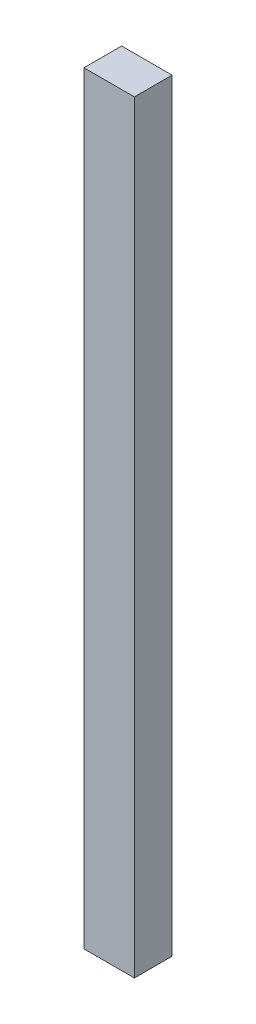
ISO-10303-21;
HEADER;
FILE_DESCRIPTION(('STEP AP214'),'2;1');
FILE_NAME('part.step','',(''),(''),'','','');
FILE_SCHEMA(('AUTOMOTIVE_DESIGN { 1 0 10303 214 1 1 1 1 }'));
ENDSEC;
DATA;
#1=APPLICATION_CONTEXT('core data for automotive mechanical design processes');
#2=APPLICATION_PROTOCOL_DEFINITION('international standard','automotive_design',2000,#1);
#3=PRODUCT_CONTEXT('',#1,'mechanical');
#4=PRODUCT('Part','Part','',(#3));
#5=PRODUCT_RELATED_PRODUCT_CATEGORY('part','',(#4));
#6=PRODUCT_DEFINITION_FORMATION('','',#4);
#7=PRODUCT_DEFINITION_CONTEXT('part definition',#1,'design');
#8=PRODUCT_DEFINITION('design','',#6,#7);
#9=PRODUCT_DEFINITION_SHAPE('','',#8);
#10=(LENGTH_UNIT() NAMED_UNIT(*) SI_UNIT(.MILLI.,.METRE.));
#11=(NAMED_UNIT(*) PLANE_ANGLE_UNIT() SI_UNIT($,.RADIAN.));
#12=(NAMED_UNIT(*) SI_UNIT($,.STERADIAN.) SOLID_ANGLE_UNIT());
#13=UNCERTAINTY_MEASURE_WITH_UNIT(LENGTH_MEASURE(1.E-05),#10,'distance_accuracy_value','');
#14=(GEOMETRIC_REPRESENTATION_CONTEXT(3) GLOBAL_UNCERTAINTY_ASSIGNED_CONTEXT((#13)) GLOBAL_UNIT_ASSIGNED_CONTEXT((#10,
#11,#12)) REPRESENTATION_CONTEXT('',''));
#15=CARTESIAN_POINT('',(0.,0.,0.));
#16=DIRECTION('',(0.,0.,1.));
#17=DIRECTION('',(1.,0.,0.));
#18=AXIS2_PLACEMENT_3D('',#15,#16,#17);
#19=CARTESIAN_POINT('',(-27.8320890870254,889.,24.5000784216773));
#20=DIRECTION('',(1.,0.,0.));
#21=DIRECTION('',(0.,0.,-1.));
#22=AXIS2_PLACEMENT_3D('',#19,#20,#21);
#23=PLANE('',#22);
#24=DIRECTION('',(0.,0.,1.));
#25=VECTOR('',#24,1.);
#26=CARTESIAN_POINT('',(-27.8320890870254,0.,24.5000784216773));
#27=LINE('',#26,#25);
#28=CARTESIAN_POINT('',(-27.8320890870254,0.,-19.4040621099685));
#29=VERTEX_POINT('',#28);
#30=CARTESIAN_POINT('',(-27.8320890870254,0.,24.5000784216773));
#31=VERTEX_POINT('',#30);
#32=EDGE_CURVE('E96',#29,#31,#27,.T.);
#33=ORIENTED_EDGE('',*,*,#32,.T.);
#34=DIRECTION('',(0.,-1.,0.));
#35=VECTOR('',#34,1.);
#36=CARTESIAN_POINT('',(-27.8320890870254,889.,24.5000784216773));
#37=LINE('',#36,#35);
#38=CARTESIAN_POINT('',(-27.8320890870254,889.,24.5000784216773));
#39=VERTEX_POINT('',#38);
#40=EDGE_CURVE('E11',#39,#31,#37,.T.);
#41=ORIENTED_EDGE('',*,*,#40,.F.);
#42=DIRECTION('',(0.,0.,1.));
#43=VECTOR('',#42,1.);
#44=CARTESIAN_POINT('',(-27.8320890870254,889.,24.5000784216773));
#45=LINE('',#44,#43);
#46=CARTESIAN_POINT('',(-27.8320890870254,889.,-19.4040621099685));
#47=VERTEX_POINT('',#46);
#48=EDGE_CURVE('E84',#47,#39,#45,.T.);
#49=ORIENTED_EDGE('',*,*,#48,.F.);
#50=DIRECTION('',(0.,-1.,0.));
#51=VECTOR('',#50,1.);
#52=CARTESIAN_POINT('',(-27.8320890870254,889.,-19.4040621099685));
#53=LINE('',#52,#51);
#54=EDGE_CURVE('E92',#47,#29,#53,.T.);
#55=ORIENTED_EDGE('',*,*,#54,.T.);
#56=EDGE_LOOP('',(#33,#41,#49,#55));
#57=FACE_BOUND('',#56,.T.);
#58=ADVANCED_FACE('F33',(#57),#23,.F.);
#59=CARTESIAN_POINT('',(30.9680991250002,889.,24.5000784216773));
#60=DIRECTION('',(0.,0.,-1.));
#61=DIRECTION('',(-1.,0.,0.));
#62=AXIS2_PLACEMENT_3D('',#59,#60,#61);
#63=PLANE('',#62);
#64=DIRECTION('',(1.,0.,0.));
#65=VECTOR('',#64,1.);
#66=CARTESIAN_POINT('',(30.9680991250002,0.,24.5000784216773));
#67=LINE('',#66,#65);
#68=CARTESIAN_POINT('',(30.9680991250002,0.,24.5000784216773));
#69=VERTEX_POINT('',#68);
#70=EDGE_CURVE('E88',#31,#69,#67,.T.);
#71=ORIENTED_EDGE('',*,*,#70,.T.);
#72=DIRECTION('',(0.,-1.,0.));
#73=VECTOR('',#72,1.);
#74=CARTESIAN_POINT('',(30.9680991250002,889.,24.5000784216773));
#75=LINE('',#74,#73);
#76=CARTESIAN_POINT('',(30.9680991250002,889.,24.5000784216773));
#77=VERTEX_POINT('',#76);
#78=EDGE_CURVE('E41',#77,#69,#75,.T.);
#79=ORIENTED_EDGE('',*,*,#78,.F.);
#80=DIRECTION('',(1.,0.,0.));
#81=VECTOR('',#80,1.);
#82=CARTESIAN_POINT('',(30.9680991250002,889.,24.5000784216773));
#83=LINE('',#82,#81);
#84=EDGE_CURVE('E79',#39,#77,#83,.T.);
#85=ORIENTED_EDGE('',*,*,#84,.F.);
#86=ORIENTED_EDGE('',*,*,#40,.T.);
#87=EDGE_LOOP('',(#71,#79,#85,#86));
#88=FACE_BOUND('',#87,.T.);
#89=ADVANCED_FACE('F87',(#88),#63,.F.);
#90=CARTESIAN_POINT('',(30.9680991250002,889.,-19.4040621099685));
#91=DIRECTION('',(-1.,0.,0.));
#92=DIRECTION('',(0.,0.,1.));
#93=AXIS2_PLACEMENT_3D('',#90,#91,#92);
#94=PLANE('',#93);
#95=DIRECTION('',(0.,0.,-1.));
#96=VECTOR('',#95,1.);
#97=CARTESIAN_POINT('',(30.9680991250002,0.,-19.4040621099685));
#98=LINE('',#97,#96);
#99=CARTESIAN_POINT('',(30.9680991250002,0.,-19.4040621099685));
#100=VERTEX_POINT('',#99);
#101=EDGE_CURVE('E66',#69,#100,#98,.T.);
#102=ORIENTED_EDGE('',*,*,#101,.T.);
#103=DIRECTION('',(0.,-1.,0.));
#104=VECTOR('',#103,1.);
#105=CARTESIAN_POINT('',(30.9680991250002,889.,-19.4040621099685));
#106=LINE('',#105,#104);
#107=CARTESIAN_POINT('',(30.9680991250002,889.,-19.4040621099685));
#108=VERTEX_POINT('',#107);
#109=EDGE_CURVE('E89',#108,#100,#106,.T.);
#110=ORIENTED_EDGE('',*,*,#109,.F.);
#111=DIRECTION('',(0.,0.,-1.));
#112=VECTOR('',#111,1.);
#113=CARTESIAN_POINT('',(30.9680991250002,889.,-19.4040621099685));
#114=LINE('',#113,#112);
#115=EDGE_CURVE('E82',#77,#108,#114,.T.);
#116=ORIENTED_EDGE('',*,*,#115,.F.);
#117=ORIENTED_EDGE('',*,*,#78,.T.);
#118=EDGE_LOOP('',(#102,#110,#116,#117));
#119=FACE_BOUND('',#118,.T.);
#120=ADVANCED_FACE('F90',(#119),#94,.F.);
#121=CARTESIAN_POINT('',(-27.8320890870254,889.,-19.4040621099685));
#122=DIRECTION('',(0.,0.,1.));
#123=DIRECTION('',(1.,0.,0.));
#124=AXIS2_PLACEMENT_3D('',#121,#122,#123);
#125=PLANE('',#124);
#126=DIRECTION('',(-1.,0.,0.));
#127=VECTOR('',#126,1.);
#128=CARTESIAN_POINT('',(-27.8320890870254,0.,-19.4040621099685));
#129=LINE('',#128,#127);
#130=EDGE_CURVE('E72',#100,#29,#129,.T.);
#131=ORIENTED_EDGE('',*,*,#130,.T.);
#132=ORIENTED_EDGE('',*,*,#54,.F.);
#133=DIRECTION('',(-1.,0.,0.));
#134=VECTOR('',#133,1.);
#135=CARTESIAN_POINT('',(-27.8320890870254,889.,-19.4040621099685));
#136=LINE('',#135,#134);
#137=EDGE_CURVE('E49',#108,#47,#136,.T.);
#138=ORIENTED_EDGE('',*,*,#137,.F.);
#139=ORIENTED_EDGE('',*,*,#109,.T.);
#140=EDGE_LOOP('',(#131,#132,#138,#139));
#141=FACE_BOUND('',#140,.T.);
#142=ADVANCED_FACE('F103',(#141),#125,.F.);
#143=CARTESIAN_POINT('',(0.,889.,0.));
#144=DIRECTION('',(0.,-1.,0.));
#145=DIRECTION('',(0.,0.,-1.));
#146=AXIS2_PLACEMENT_3D('',#143,#144,#145);
#147=PLANE('',#146);
#148=ORIENTED_EDGE('',*,*,#48,.T.);
#149=ORIENTED_EDGE('',*,*,#84,.T.);
#150=ORIENTED_EDGE('',*,*,#115,.T.);
#151=ORIENTED_EDGE('',*,*,#137,.T.);
#152=EDGE_LOOP('',(#148,#149,#150,#151));
#153=FACE_BOUND('',#152,.T.);
#154=ADVANCED_FACE('F80',(#153),#147,.F.);
#155=CARTESIAN_POINT('',(0.,0.,0.));
#156=DIRECTION('',(0.,-1.,0.));
#157=DIRECTION('',(0.,0.,-1.));
#158=AXIS2_PLACEMENT_3D('',#155,#156,#157);
#159=PLANE('',#158);
#160=ORIENTED_EDGE('',*,*,#32,.F.);
#161=ORIENTED_EDGE('',*,*,#130,.F.);
#162=ORIENTED_EDGE('',*,*,#101,.F.);
#163=ORIENTED_EDGE('',*,*,#70,.F.);
#164=EDGE_LOOP('',(#160,#161,#162,#163));
#165=FACE_BOUND('',#164,.T.);
#166=ADVANCED_FACE('F106',(#165),#159,.T.);
#167=CLOSED_SHELL('',(#58,#89,#120,#142,#154,#166));
#168=MANIFOLD_SOLID_BREP('B2',#167);
#169=ADVANCED_BREP_SHAPE_REPRESENTATION('',(#18,#168),#14);
#170=SHAPE_DEFINITION_REPRESENTATION(#9,#169);
ENDSEC;
END-ISO-10303-21;
